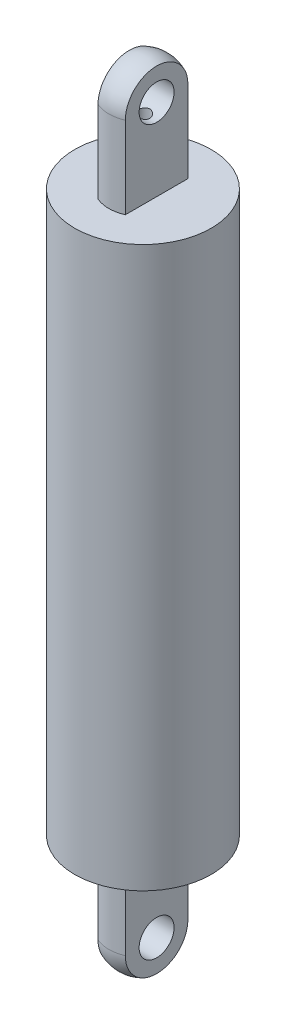
ISO-10303-21;
HEADER;
FILE_DESCRIPTION(('STEP AP214'),'2;1');
FILE_NAME('part.step','',(''),(''),'','','');
FILE_SCHEMA(('AUTOMOTIVE_DESIGN { 1 0 10303 214 1 1 1 1 }'));
ENDSEC;
DATA;
#1=APPLICATION_CONTEXT('core data for automotive mechanical design processes');
#2=APPLICATION_PROTOCOL_DEFINITION('international standard','automotive_design',2000,#1);
#3=PRODUCT_CONTEXT('',#1,'mechanical');
#4=PRODUCT('Part','Part','',(#3));
#5=PRODUCT_RELATED_PRODUCT_CATEGORY('part','',(#4));
#6=PRODUCT_DEFINITION_FORMATION('','',#4);
#7=PRODUCT_DEFINITION_CONTEXT('part definition',#1,'design');
#8=PRODUCT_DEFINITION('design','',#6,#7);
#9=PRODUCT_DEFINITION_SHAPE('','',#8);
#10=(LENGTH_UNIT() NAMED_UNIT(*) SI_UNIT(.MILLI.,.METRE.));
#11=(NAMED_UNIT(*) PLANE_ANGLE_UNIT() SI_UNIT($,.RADIAN.));
#12=(NAMED_UNIT(*) SI_UNIT($,.STERADIAN.) SOLID_ANGLE_UNIT());
#13=UNCERTAINTY_MEASURE_WITH_UNIT(LENGTH_MEASURE(1.E-05),#10,'distance_accuracy_value','');
#14=(GEOMETRIC_REPRESENTATION_CONTEXT(3) GLOBAL_UNCERTAINTY_ASSIGNED_CONTEXT((#13)) GLOBAL_UNIT_ASSIGNED_CONTEXT((#10,
#11,#12)) REPRESENTATION_CONTEXT('',''));
#15=CARTESIAN_POINT('',(0.,0.,0.));
#16=DIRECTION('',(0.,0.,1.));
#17=DIRECTION('',(1.,0.,0.));
#18=AXIS2_PLACEMENT_3D('',#15,#16,#17);
#19=CARTESIAN_POINT('',(0.,33.655,0.));
#20=DIRECTION('',(0.,1.,0.));
#21=DIRECTION('',(0.,0.,1.));
#22=AXIS2_PLACEMENT_3D('',#19,#20,#21);
#23=CYLINDRICAL_SURFACE('',#22,3.175);
#24=CARTESIAN_POINT('',(0.,-33.655,0.));
#25=DIRECTION('',(0.,1.,0.));
#26=DIRECTION('',(0.,0.,1.));
#27=AXIS2_PLACEMENT_3D('',#24,#25,#26);
#28=CIRCLE('',#27,3.175);
#29=CARTESIAN_POINT('',(1.27,-33.655,-2.90993556629696));
#30=VERTEX_POINT('',#29);
#31=CARTESIAN_POINT('',(-1.27,-33.655,-2.90993556629696));
#32=VERTEX_POINT('',#31);
#33=EDGE_CURVE('E124',#30,#32,#28,.T.);
#34=ORIENTED_EDGE('',*,*,#33,.T.);
#35=DIRECTION('',(0.,1.,0.));
#36=VECTOR('',#35,1.);
#37=CARTESIAN_POINT('',(-1.27,-36.83,-2.90993556629696));
#38=LINE('',#37,#36);
#39=CARTESIAN_POINT('',(-1.27,-26.035,-2.90993556629696));
#40=VERTEX_POINT('',#39);
#41=EDGE_CURVE('E61',#32,#40,#38,.T.);
#42=ORIENTED_EDGE('',*,*,#41,.T.);
#43=CARTESIAN_POINT('',(0.,-26.035,0.));
#44=DIRECTION('',(0.,1.,0.));
#45=DIRECTION('',(0.,0.,1.));
#46=AXIS2_PLACEMENT_3D('',#43,#44,#45);
#47=CIRCLE('',#46,3.175);
#48=CARTESIAN_POINT('',(1.27,-26.035,-2.90993556629696));
#49=VERTEX_POINT('',#48);
#50=EDGE_CURVE('E122',#49,#40,#47,.T.);
#51=ORIENTED_EDGE('',*,*,#50,.F.);
#52=DIRECTION('',(0.,1.,0.));
#53=VECTOR('',#52,1.);
#54=CARTESIAN_POINT('',(1.27,-36.83,-2.90993556629696));
#55=LINE('',#54,#53);
#56=EDGE_CURVE('E116',#30,#49,#55,.T.);
#57=ORIENTED_EDGE('',*,*,#56,.F.);
#58=EDGE_LOOP('',(#34,#42,#51,#57));
#59=FACE_BOUND('',#58,.T.);
#60=ADVANCED_FACE('F39',(#59),#23,.T.);
#61=CARTESIAN_POINT('',(-1.27,-26.035,2.90993556629695));
#62=VERTEX_POINT('',#61);
#63=CARTESIAN_POINT('',(1.27,-26.035,2.90993556629695));
#64=VERTEX_POINT('',#63);
#65=EDGE_CURVE('E131',#62,#64,#47,.T.);
#66=ORIENTED_EDGE('',*,*,#65,.F.);
#67=DIRECTION('',(0.,1.,0.));
#68=VECTOR('',#67,1.);
#69=CARTESIAN_POINT('',(-1.27,-36.83,2.90993556629695));
#70=LINE('',#69,#68);
#71=CARTESIAN_POINT('',(-1.27,-33.655,2.90993556629695));
#72=VERTEX_POINT('',#71);
#73=EDGE_CURVE('E111',#72,#62,#70,.T.);
#74=ORIENTED_EDGE('',*,*,#73,.F.);
#75=CARTESIAN_POINT('',(1.27,-33.655,2.90993556629695));
#76=VERTEX_POINT('',#75);
#77=EDGE_CURVE('E137',#72,#76,#28,.T.);
#78=ORIENTED_EDGE('',*,*,#77,.T.);
#79=DIRECTION('',(0.,1.,0.));
#80=VECTOR('',#79,1.);
#81=CARTESIAN_POINT('',(1.27,-36.83,2.90993556629695));
#82=LINE('',#81,#80);
#83=EDGE_CURVE('E68',#76,#64,#82,.T.);
#84=ORIENTED_EDGE('',*,*,#83,.T.);
#85=EDGE_LOOP('',(#66,#74,#78,#84));
#86=FACE_BOUND('',#85,.T.);
#87=ADVANCED_FACE('F195',(#86),#23,.T.);
#88=CARTESIAN_POINT('',(0.,-33.655,0.));
#89=DIRECTION('',(0.,1.,0.));
#90=DIRECTION('',(0.,0.,1.));
#91=AXIS2_PLACEMENT_3D('',#88,#89,#90);
#92=SPHERICAL_SURFACE('',#91,3.175);
#93=ORIENTED_EDGE('',*,*,#77,.F.);
#94=CARTESIAN_POINT('',(-1.27,-33.655,0.));
#95=DIRECTION('',(1.,0.,0.));
#96=DIRECTION('',(0.,0.,-1.));
#97=AXIS2_PLACEMENT_3D('',#94,#95,#96);
#98=CIRCLE('',#97,2.90993556629696);
#99=EDGE_CURVE('E11',#72,#32,#98,.T.);
#100=ORIENTED_EDGE('',*,*,#99,.T.);
#101=ORIENTED_EDGE('',*,*,#33,.F.);
#102=CARTESIAN_POINT('',(1.27,-33.655,0.));
#103=DIRECTION('',(1.,0.,0.));
#104=DIRECTION('',(0.,0.,-1.));
#105=AXIS2_PLACEMENT_3D('',#102,#103,#104);
#106=CIRCLE('',#105,2.90993556629696);
#107=EDGE_CURVE('E53',#76,#30,#106,.T.);
#108=ORIENTED_EDGE('',*,*,#107,.F.);
#109=EDGE_LOOP('',(#93,#100,#101,#108));
#110=FACE_BOUND('',#109,.T.);
#111=ADVANCED_FACE('F201',(#110),#92,.T.);
#112=CARTESIAN_POINT('',(0.,33.655,0.));
#113=DIRECTION('',(0.,1.,0.));
#114=DIRECTION('',(0.,0.,1.));
#115=AXIS2_PLACEMENT_3D('',#112,#113,#114);
#116=SPHERICAL_SURFACE('',#115,3.175);
#117=CARTESIAN_POINT('',(-1.27,33.655,0.));
#118=DIRECTION('',(-1.,0.,0.));
#119=DIRECTION('',(0.,0.,1.));
#120=AXIS2_PLACEMENT_3D('',#117,#118,#119);
#121=CIRCLE('',#120,2.90993556629696);
#122=CARTESIAN_POINT('',(-1.27,33.655,2.90993556629695));
#123=VERTEX_POINT('',#122);
#124=CARTESIAN_POINT('',(-1.27,33.655,-2.90993556629696));
#125=VERTEX_POINT('',#124);
#126=EDGE_CURVE('E246',#123,#125,#121,.T.);
#127=ORIENTED_EDGE('',*,*,#126,.F.);
#128=CARTESIAN_POINT('',(0.,33.655,0.));
#129=DIRECTION('',(0.,1.,0.));
#130=DIRECTION('',(0.,0.,1.));
#131=AXIS2_PLACEMENT_3D('',#128,#129,#130);
#132=CIRCLE('',#131,3.175);
#133=CARTESIAN_POINT('',(1.27,33.655,2.90993556629695));
#134=VERTEX_POINT('',#133);
#135=EDGE_CURVE('E146',#123,#134,#132,.T.);
#136=ORIENTED_EDGE('',*,*,#135,.T.);
#137=CARTESIAN_POINT('',(1.27,33.655,0.));
#138=DIRECTION('',(-1.,0.,0.));
#139=DIRECTION('',(0.,0.,1.));
#140=AXIS2_PLACEMENT_3D('',#137,#138,#139);
#141=CIRCLE('',#140,2.90993556629696);
#142=CARTESIAN_POINT('',(1.27,33.655,-2.90993556629696));
#143=VERTEX_POINT('',#142);
#144=EDGE_CURVE('E227',#134,#143,#141,.T.);
#145=ORIENTED_EDGE('',*,*,#144,.T.);
#146=EDGE_CURVE('E149',#143,#125,#132,.T.);
#147=ORIENTED_EDGE('',*,*,#146,.T.);
#148=EDGE_LOOP('',(#127,#136,#145,#147));
#149=FACE_BOUND('',#148,.T.);
#150=ADVANCED_FACE('F41',(#149),#116,.T.);
#151=CARTESIAN_POINT('',(0.,33.655,0.));
#152=DIRECTION('',(0.,1.,0.));
#153=DIRECTION('',(0.,0.,1.));
#154=AXIS2_PLACEMENT_3D('',#151,#152,#153);
#155=CYLINDRICAL_SURFACE('',#154,3.175);
#156=DIRECTION('',(0.,-1.,0.));
#157=VECTOR('',#156,1.);
#158=CARTESIAN_POINT('',(-1.27,36.83,2.90993556629695));
#159=LINE('',#158,#157);
#160=CARTESIAN_POINT('',(-1.27,26.035,2.90993556629695));
#161=VERTEX_POINT('',#160);
#162=EDGE_CURVE('E222',#123,#161,#159,.T.);
#163=ORIENTED_EDGE('',*,*,#162,.T.);
#164=CARTESIAN_POINT('',(0.,26.035,0.));
#165=DIRECTION('',(0.,1.,0.));
#166=DIRECTION('',(0.,0.,1.));
#167=AXIS2_PLACEMENT_3D('',#164,#165,#166);
#168=CIRCLE('',#167,3.175);
#169=CARTESIAN_POINT('',(1.27,26.035,2.90993556629695));
#170=VERTEX_POINT('',#169);
#171=EDGE_CURVE('E142',#161,#170,#168,.T.);
#172=ORIENTED_EDGE('',*,*,#171,.T.);
#173=DIRECTION('',(0.,-1.,0.));
#174=VECTOR('',#173,1.);
#175=CARTESIAN_POINT('',(1.27,36.83,2.90993556629695));
#176=LINE('',#175,#174);
#177=EDGE_CURVE('E239',#134,#170,#176,.T.);
#178=ORIENTED_EDGE('',*,*,#177,.F.);
#179=ORIENTED_EDGE('',*,*,#135,.F.);
#180=EDGE_LOOP('',(#163,#172,#178,#179));
#181=FACE_BOUND('',#180,.T.);
#182=ADVANCED_FACE('F211',(#181),#155,.T.);
#183=DIRECTION('',(0.,-1.,0.));
#184=VECTOR('',#183,1.);
#185=CARTESIAN_POINT('',(-1.27,36.83,-2.90993556629696));
#186=LINE('',#185,#184);
#187=CARTESIAN_POINT('',(-1.27,26.035,-2.90993556629696));
#188=VERTEX_POINT('',#187);
#189=EDGE_CURVE('E228',#125,#188,#186,.T.);
#190=ORIENTED_EDGE('',*,*,#189,.F.);
#191=ORIENTED_EDGE('',*,*,#146,.F.);
#192=DIRECTION('',(0.,-1.,0.));
#193=VECTOR('',#192,1.);
#194=CARTESIAN_POINT('',(1.27,36.83,-2.90993556629696));
#195=LINE('',#194,#193);
#196=CARTESIAN_POINT('',(1.27,26.035,-2.90993556629696));
#197=VERTEX_POINT('',#196);
#198=EDGE_CURVE('E237',#143,#197,#195,.T.);
#199=ORIENTED_EDGE('',*,*,#198,.T.);
#200=EDGE_CURVE('E145',#197,#188,#168,.T.);
#201=ORIENTED_EDGE('',*,*,#200,.T.);
#202=EDGE_LOOP('',(#190,#191,#199,#201));
#203=FACE_BOUND('',#202,.T.);
#204=ADVANCED_FACE('F209',(#203),#155,.T.);
#205=CARTESIAN_POINT('',(0.,26.035,3.17499999999999));
#206=DIRECTION('',(0.,-1.,0.));
#207=DIRECTION('',(0.,0.,-1.));
#208=AXIS2_PLACEMENT_3D('',#205,#206,#207);
#209=PLANE('',#208);
#210=ORIENTED_EDGE('',*,*,#200,.F.);
#211=DIRECTION('',(0.,0.,-1.));
#212=VECTOR('',#211,1.);
#213=CARTESIAN_POINT('',(1.27,26.035,0.));
#214=LINE('',#213,#212);
#215=EDGE_CURVE('E125',#170,#197,#214,.T.);
#216=ORIENTED_EDGE('',*,*,#215,.F.);
#217=ORIENTED_EDGE('',*,*,#171,.F.);
#218=DIRECTION('',(0.,0.,-1.));
#219=VECTOR('',#218,1.);
#220=CARTESIAN_POINT('',(-1.27,26.035,0.));
#221=LINE('',#220,#219);
#222=EDGE_CURVE('E232',#161,#188,#221,.T.);
#223=ORIENTED_EDGE('',*,*,#222,.T.);
#224=EDGE_LOOP('',(#210,#216,#217,#223));
#225=FACE_BOUND('',#224,.T.);
#226=CARTESIAN_POINT('',(0.,26.035,0.));
#227=DIRECTION('',(0.,1.,0.));
#228=DIRECTION('',(0.,0.,1.));
#229=AXIS2_PLACEMENT_3D('',#226,#227,#228);
#230=CIRCLE('',#229,6.35);
#231=CARTESIAN_POINT('',(0.,26.035,6.34999999999999));
#232=VERTEX_POINT('',#231);
#233=EDGE_CURVE('E134',#232,#232,#230,.T.);
#234=ORIENTED_EDGE('',*,*,#233,.T.);
#235=EDGE_LOOP('',(#234));
#236=FACE_BOUND('',#235,.T.);
#237=ADVANCED_FACE('F207',(#225,#236),#209,.F.);
#238=CARTESIAN_POINT('',(0.,33.655,0.));
#239=DIRECTION('',(0.,1.,0.));
#240=DIRECTION('',(0.,0.,1.));
#241=AXIS2_PLACEMENT_3D('',#238,#239,#240);
#242=CYLINDRICAL_SURFACE('',#241,6.35);
#243=ORIENTED_EDGE('',*,*,#233,.F.);
#244=EDGE_LOOP('',(#243));
#245=FACE_BOUND('',#244,.T.);
#246=CARTESIAN_POINT('',(0.,-26.035,0.));
#247=DIRECTION('',(0.,1.,0.));
#248=DIRECTION('',(0.,0.,1.));
#249=AXIS2_PLACEMENT_3D('',#246,#247,#248);
#250=CIRCLE('',#249,6.35);
#251=CARTESIAN_POINT('',(0.,-26.035,6.34999999999999));
#252=VERTEX_POINT('',#251);
#253=EDGE_CURVE('E130',#252,#252,#250,.T.);
#254=ORIENTED_EDGE('',*,*,#253,.T.);
#255=EDGE_LOOP('',(#254));
#256=FACE_BOUND('',#255,.T.);
#257=ADVANCED_FACE('F189',(#245,#256),#242,.T.);
#258=CARTESIAN_POINT('',(0.,-26.035,3.17499999999999));
#259=DIRECTION('',(0.,1.,0.));
#260=DIRECTION('',(0.,0.,1.));
#261=AXIS2_PLACEMENT_3D('',#258,#259,#260);
#262=PLANE('',#261);
#263=ORIENTED_EDGE('',*,*,#253,.F.);
#264=EDGE_LOOP('',(#263));
#265=FACE_BOUND('',#264,.T.);
#266=ORIENTED_EDGE('',*,*,#65,.T.);
#267=DIRECTION('',(0.,0.,-1.));
#268=VECTOR('',#267,1.);
#269=CARTESIAN_POINT('',(1.27,-26.035,0.));
#270=LINE('',#269,#268);
#271=EDGE_CURVE('E129',#64,#49,#270,.T.);
#272=ORIENTED_EDGE('',*,*,#271,.T.);
#273=ORIENTED_EDGE('',*,*,#50,.T.);
#274=DIRECTION('',(0.,0.,-1.));
#275=VECTOR('',#274,1.);
#276=CARTESIAN_POINT('',(-1.27,-26.035,0.));
#277=LINE('',#276,#275);
#278=EDGE_CURVE('E108',#62,#40,#277,.T.);
#279=ORIENTED_EDGE('',*,*,#278,.F.);
#280=EDGE_LOOP('',(#266,#272,#273,#279));
#281=FACE_BOUND('',#280,.T.);
#282=ADVANCED_FACE('F128',(#265,#281),#262,.F.);
#283=CARTESIAN_POINT('',(1.27,36.83,0.));
#284=DIRECTION('',(-1.,0.,0.));
#285=DIRECTION('',(0.,0.,1.));
#286=AXIS2_PLACEMENT_3D('',#283,#284,#285);
#287=PLANE('',#286);
#288=CARTESIAN_POINT('',(1.27,33.655,0.));
#289=DIRECTION('',(1.,0.,0.));
#290=DIRECTION('',(0.,0.,-1.));
#291=AXIS2_PLACEMENT_3D('',#288,#289,#290);
#292=CIRCLE('',#291,1.627);
#293=CARTESIAN_POINT('',(1.27,33.655,-1.62700000000001));
#294=VERTEX_POINT('',#293);
#295=EDGE_CURVE('E158',#294,#294,#292,.T.);
#296=ORIENTED_EDGE('',*,*,#295,.F.);
#297=EDGE_LOOP('',(#296));
#298=FACE_BOUND('',#297,.T.);
#299=ORIENTED_EDGE('',*,*,#177,.T.);
#300=ORIENTED_EDGE('',*,*,#215,.T.);
#301=ORIENTED_EDGE('',*,*,#198,.F.);
#302=ORIENTED_EDGE('',*,*,#144,.F.);
#303=EDGE_LOOP('',(#299,#300,#301,#302));
#304=FACE_BOUND('',#303,.T.);
#305=ADVANCED_FACE('F182',(#298,#304),#287,.F.);
#306=CARTESIAN_POINT('',(-1.27,36.83,0.));
#307=DIRECTION('',(-1.,0.,0.));
#308=DIRECTION('',(0.,0.,1.));
#309=AXIS2_PLACEMENT_3D('',#306,#307,#308);
#310=PLANE('',#309);
#311=CARTESIAN_POINT('',(-1.27,33.655,0.));
#312=DIRECTION('',(-1.,0.,0.));
#313=DIRECTION('',(0.,0.,1.));
#314=AXIS2_PLACEMENT_3D('',#311,#312,#313);
#315=CIRCLE('',#314,1.627);
#316=CARTESIAN_POINT('',(-1.27,33.655,1.62699999999999));
#317=VERTEX_POINT('',#316);
#318=EDGE_CURVE('E157',#317,#317,#315,.T.);
#319=ORIENTED_EDGE('',*,*,#318,.F.);
#320=EDGE_LOOP('',(#319));
#321=FACE_BOUND('',#320,.T.);
#322=ORIENTED_EDGE('',*,*,#126,.T.);
#323=ORIENTED_EDGE('',*,*,#189,.T.);
#324=ORIENTED_EDGE('',*,*,#222,.F.);
#325=ORIENTED_EDGE('',*,*,#162,.F.);
#326=EDGE_LOOP('',(#322,#323,#324,#325));
#327=FACE_BOUND('',#326,.T.);
#328=ADVANCED_FACE('F179',(#321,#327),#310,.T.);
#329=CARTESIAN_POINT('',(1.27,-36.83,0.));
#330=DIRECTION('',(1.,0.,0.));
#331=DIRECTION('',(0.,0.,-1.));
#332=AXIS2_PLACEMENT_3D('',#329,#330,#331);
#333=PLANE('',#332);
#334=CARTESIAN_POINT('',(1.27,-33.655,0.));
#335=DIRECTION('',(1.,0.,0.));
#336=DIRECTION('',(0.,0.,-1.));
#337=AXIS2_PLACEMENT_3D('',#334,#335,#336);
#338=CIRCLE('',#337,1.627);
#339=CARTESIAN_POINT('',(1.27,-33.655,-1.62700000000001));
#340=VERTEX_POINT('',#339);
#341=EDGE_CURVE('E277',#340,#340,#338,.T.);
#342=ORIENTED_EDGE('',*,*,#341,.F.);
#343=EDGE_LOOP('',(#342));
#344=FACE_BOUND('',#343,.T.);
#345=ORIENTED_EDGE('',*,*,#107,.T.);
#346=ORIENTED_EDGE('',*,*,#56,.T.);
#347=ORIENTED_EDGE('',*,*,#271,.F.);
#348=ORIENTED_EDGE('',*,*,#83,.F.);
#349=EDGE_LOOP('',(#345,#346,#347,#348));
#350=FACE_BOUND('',#349,.T.);
#351=ADVANCED_FACE('F175',(#344,#350),#333,.T.);
#352=CARTESIAN_POINT('',(-1.27,-36.83,0.));
#353=DIRECTION('',(1.,0.,0.));
#354=DIRECTION('',(0.,0.,-1.));
#355=AXIS2_PLACEMENT_3D('',#352,#353,#354);
#356=PLANE('',#355);
#357=CARTESIAN_POINT('',(-1.27,-33.655,0.));
#358=DIRECTION('',(1.,0.,0.));
#359=DIRECTION('',(0.,0.,-1.));
#360=AXIS2_PLACEMENT_3D('',#357,#358,#359);
#361=CIRCLE('',#360,1.627);
#362=CARTESIAN_POINT('',(-1.27,-33.655,-1.62700000000001));
#363=VERTEX_POINT('',#362);
#364=EDGE_CURVE('E270',#363,#363,#361,.T.);
#365=ORIENTED_EDGE('',*,*,#364,.T.);
#366=EDGE_LOOP('',(#365));
#367=FACE_BOUND('',#366,.T.);
#368=ORIENTED_EDGE('',*,*,#73,.T.);
#369=ORIENTED_EDGE('',*,*,#278,.T.);
#370=ORIENTED_EDGE('',*,*,#41,.F.);
#371=ORIENTED_EDGE('',*,*,#99,.F.);
#372=EDGE_LOOP('',(#368,#369,#370,#371));
#373=FACE_BOUND('',#372,.T.);
#374=ADVANCED_FACE('F109',(#367,#373),#356,.F.);
#375=CARTESIAN_POINT('',(-6.35,33.655,0.));
#376=DIRECTION('',(1.,0.,0.));
#377=DIRECTION('',(0.,0.,-1.));
#378=AXIS2_PLACEMENT_3D('',#375,#376,#377);
#379=CYLINDRICAL_SURFACE('',#378,1.627);
#380=ORIENTED_EDGE('',*,*,#318,.T.);
#381=EDGE_LOOP('',(#380));
#382=FACE_BOUND('',#381,.T.);
#383=CARTESIAN_POINT('',(0.,32.157033378209,0.634999999999991));
#384=CARTESIAN_POINT('',(-0.034175607189574,32.1570351723678,0.63500183932402));
#385=CARTESIAN_POINT('',(-0.0683397244226082,32.1558511835887,0.632231929951331));
#386=CARTESIAN_POINT('',(-0.135631172071987,32.1512801662181,0.621281481817421));
#387=CARTESIAN_POINT('',(-0.168758595955889,32.1478933368364,0.613101432311161));
#388=CARTESIAN_POINT('',(-0.232983302009291,32.1393574907449,0.591682137368026));
#389=CARTESIAN_POINT('',(-0.264085576939568,32.1342130195811,0.578455931911288));
#390=CARTESIAN_POINT('',(-0.323642193094697,32.1227491603127,0.547366464748788));
#391=CARTESIAN_POINT('',(-0.352095669626303,32.1164293905392,0.529501695957632));
#392=CARTESIAN_POINT('',(-0.407081822193419,32.102945310168,0.488610391464089));
#393=CARTESIAN_POINT('',(-0.43345174418174,32.0957547756635,0.465373592314362));
#394=CARTESIAN_POINT('',(-0.482036572156737,32.0815571043641,0.41484293945535));
#395=CARTESIAN_POINT('',(-0.504250493980546,32.074550011346,0.387548127526469));
#396=CARTESIAN_POINT('',(-0.544695276116175,32.0611937473742,0.328422845778443));
#397=CARTESIAN_POINT('',(-0.562746687870122,32.054878860444,0.296461182283711));
#398=CARTESIAN_POINT('',(-0.593147774886062,32.0439363099161,0.22966427043901));
#399=CARTESIAN_POINT('',(-0.605499605809712,32.0393080085676,0.194830114391376));
#400=CARTESIAN_POINT('',(-0.623572449602518,32.0324464838259,0.124989854467328));
#401=CARTESIAN_POINT('',(-0.629574223015851,32.0301122067617,0.0900665292405033));
#402=CARTESIAN_POINT('',(-0.635678895009102,32.0277375117914,0.0196355584853128));
#403=CARTESIAN_POINT('',(-0.635783871906567,32.0276962857027,-0.015871876760671));
#404=CARTESIAN_POINT('',(-0.630249654866893,32.0298497521898,-0.0844405458569177));
#405=CARTESIAN_POINT('',(-0.624917591706195,32.0319248951441,-0.117530992434519));
#406=CARTESIAN_POINT('',(-0.609180784148746,32.0379185034826,-0.182304293617838));
#407=CARTESIAN_POINT('',(-0.59877567786212,32.0418371003705,-0.213987047628644));
#408=CARTESIAN_POINT('',(-0.573058961421459,32.0512058894899,-0.275608535770085));
#409=CARTESIAN_POINT('',(-0.557676542067525,32.0566780363195,-0.305514242905016));
#410=CARTESIAN_POINT('',(-0.522506661643956,32.0686066304195,-0.362396115602885));
#411=CARTESIAN_POINT('',(-0.502717720499885,32.0750634081802,-0.389371292311176));
#412=CARTESIAN_POINT('',(-0.457845000639074,32.0887809836563,-0.441425688282831));
#413=CARTESIAN_POINT('',(-0.432506579734241,32.0960668088799,-0.466279134134579));
#414=CARTESIAN_POINT('',(-0.377986801146246,32.1103037800619,-0.511473636142813));
#415=CARTESIAN_POINT('',(-0.348804310400437,32.1172548265143,-0.531813357087641));
#416=CARTESIAN_POINT('',(-0.286462536976218,32.1302005666321,-0.567885161975138));
#417=CARTESIAN_POINT('',(-0.253220142311159,32.136165993659,-0.583484976902602));
#418=CARTESIAN_POINT('',(-0.184285518451289,32.1461241122128,-0.608777074454642));
#419=CARTESIAN_POINT('',(-0.148594804640426,32.1501180116876,-0.618472975239099));
#420=CARTESIAN_POINT('',(-0.0780213020197254,32.1553909691447,-0.631146904282569));
#421=CARTESIAN_POINT('',(-0.0432144698179266,32.1568158935882,-0.634486525907412));
#422=CARTESIAN_POINT('',(0.0264838096446982,32.1572041474884,-0.635403266735756));
#423=CARTESIAN_POINT('',(0.0613752303569779,32.1561681690918,-0.63298200622885));
#424=CARTESIAN_POINT('',(0.128306182569504,32.1519004463234,-0.622774436227281));
#425=CARTESIAN_POINT('',(0.160398755152632,32.1487882560691,-0.615279930229161));
#426=CARTESIAN_POINT('',(0.222852297905737,32.1408645171455,-0.595512632752877));
#427=CARTESIAN_POINT('',(0.253212893985931,32.1360526029547,-0.583238813436792));
#428=CARTESIAN_POINT('',(0.312673426493113,32.1250390762288,-0.553719558835788));
#429=CARTESIAN_POINT('',(0.341676532828171,32.1187901712353,-0.536297262904196));
#430=CARTESIAN_POINT('',(0.396474940198074,32.1056817384649,-0.497159269090283));
#431=CARTESIAN_POINT('',(0.422268979072801,32.0988219722385,-0.47544189054872));
#432=CARTESIAN_POINT('',(0.47178375664611,32.0846873996561,-0.426542102858492));
#433=CARTESIAN_POINT('',(0.49523480062942,32.0774169785221,-0.39908433942074));
#434=CARTESIAN_POINT('',(0.537234451638914,32.0637332685191,-0.340447433471409));
#435=CARTESIAN_POINT('',(0.555782936583528,32.0573200009965,-0.309268198317283));
#436=CARTESIAN_POINT('',(0.587359146215386,32.0460634296283,-0.244018512449137));
#437=CARTESIAN_POINT('',(0.600395782526051,32.0412175945431,-0.209952836466266));
#438=CARTESIAN_POINT('',(0.620472225148341,32.0336418067138,-0.139877564569418));
#439=CARTESIAN_POINT('',(0.627515115319234,32.0309107659461,-0.103868978461809));
#440=CARTESIAN_POINT('',(0.635051318609989,32.0279832863495,-0.0333576913000701));
#441=CARTESIAN_POINT('',(0.635926643578831,32.0276390354911,0.00109837676146093));
#442=CARTESIAN_POINT('',(0.632101341326076,32.0291301134087,0.0696478571467251));
#443=CARTESIAN_POINT('',(0.62740148442438,32.030965141075,0.103741318914931));
#444=CARTESIAN_POINT('',(0.612830732683991,32.0365370761326,0.169617289453099));
#445=CARTESIAN_POINT('',(0.603109128658899,32.0402189908198,0.20143783525507));
#446=CARTESIAN_POINT('',(0.578924375802907,32.0490948701894,0.262993854629609));
#447=CARTESIAN_POINT('',(0.564460330461814,32.0542891207427,0.292728932674596));
#448=CARTESIAN_POINT('',(0.530490090969576,32.0659566568846,0.350688216648708));
#449=CARTESIAN_POINT('',(0.510792088529331,32.0724757176602,0.378790601871024));
#450=CARTESIAN_POINT('',(0.467207020485922,32.0860011176527,0.431405512309831));
#451=CARTESIAN_POINT('',(0.443318416682775,32.0930076352233,0.455916713264168));
#452=CARTESIAN_POINT('',(0.3903801943988,32.1072226889108,0.502128433968704));
#453=CARTESIAN_POINT('',(0.361111053494799,32.1144192322637,0.52358218535802));
#454=CARTESIAN_POINT('',(0.299159063720183,32.12775211705,0.561288024615731));
#455=CARTESIAN_POINT('',(0.266475291791793,32.1338881706111,0.577538701115848));
#456=CARTESIAN_POINT('',(0.195808637676378,32.1447233722449,0.60533988928544));
#457=CARTESIAN_POINT('',(0.157611018017682,32.1492687794565,0.616411839316287));
#458=CARTESIAN_POINT('',(0.0796028290551253,32.1554215195513,0.631237789189522));
#459=CARTESIAN_POINT('',(0.0397936255055941,32.1570312891141,0.634997858315392));
#460=CARTESIAN_POINT('',(0.,32.157033378209,0.634999999999991));
#461=B_SPLINE_CURVE_WITH_KNOTS('',3,(#383,#384,#385,#386,#387,#388,#389,#390,#391,#392,#393,
#394,#395,#396,#397,#398,#399,#400,#401,#402,#403,#404,#405,#406,#407,#408,#409,#410,#411,#412,
#413,#414,#415,#416,#417,#418,#419,#420,#421,#422,#423,#424,#425,#426,#427,#428,#429,#430,#431,
#432,#433,#434,#435,#436,#437,#438,#439,#440,#441,#442,#443,#444,#445,#446,#447,#448,#449,#450,
#451,#452,#453,#454,#455,#456,#457,#458,#459,#460),.UNSPECIFIED.,.T.,.F.,(4,2,2,2,2,2,2,2,2,2,2,
2,2,2,2,2,2,2,2,2,2,2,2,2,2,2,2,2,2,2,2,2,2,2,2,2,2,2,4),(0.,0.102378335596324,
0.204747414082879,0.306853728767649,0.408993259752756,0.516144522657905,0.623321127522019,
0.734494932449747,0.845626655346578,0.951608276878337,1.05755254510385,1.15782661237157,
1.25810783382254,1.35988351447898,1.46169343152841,1.5699032039886,1.6781449435995,
1.78917650812807,1.90013995931145,2.00457666150625,2.10898399359874,2.20784558072602,
2.30672844075434,2.40950808465338,2.51232802592635,2.62231226660414,2.73229924580765,
2.84210771033042,2.95185964277363,3.05474869970196,3.15762354215995,3.25760242329466,
3.35760021532523,3.46194379990245,3.56632576523029,3.67678573502841,3.78727564248451,
3.90658269798688,4.0257906793991),.UNSPECIFIED.);
#462=CARTESIAN_POINT('',(0.,32.157033378209,0.634999999999991));
#463=VERTEX_POINT('',#462);
#464=EDGE_CURVE('E150',#463,#463,#461,.T.);
#465=ORIENTED_EDGE('',*,*,#464,.T.);
#466=EDGE_LOOP('',(#465));
#467=FACE_BOUND('',#466,.T.);
#468=ORIENTED_EDGE('',*,*,#295,.T.);
#469=EDGE_LOOP('',(#468));
#470=FACE_BOUND('',#469,.T.);
#471=ADVANCED_FACE('F163',(#382,#467,#470),#379,.F.);
#472=CARTESIAN_POINT('',(-6.35,-33.655,0.));
#473=DIRECTION('',(1.,0.,0.));
#474=DIRECTION('',(0.,0.,-1.));
#475=AXIS2_PLACEMENT_3D('',#472,#473,#474);
#476=CYLINDRICAL_SURFACE('',#475,1.627);
#477=ORIENTED_EDGE('',*,*,#341,.T.);
#478=EDGE_LOOP('',(#477));
#479=FACE_BOUND('',#478,.T.);
#480=CARTESIAN_POINT('',(0.,-32.157033378209,0.634999999999992));
#481=CARTESIAN_POINT('',(0.0341756071895736,-32.1570351723678,0.635001839324021));
#482=CARTESIAN_POINT('',(0.0683397244226075,-32.1558511835887,0.632231929951332));
#483=CARTESIAN_POINT('',(0.135631172071986,-32.1512801662181,0.621281481817422));
#484=CARTESIAN_POINT('',(0.168758595955888,-32.1478933368364,0.613101432311162));
#485=CARTESIAN_POINT('',(0.23298330200929,-32.1393574907449,0.591682137368027));
#486=CARTESIAN_POINT('',(0.264085576939567,-32.1342130195811,0.578455931911289));
#487=CARTESIAN_POINT('',(0.323642193094697,-32.1227491603127,0.54736646474879));
#488=CARTESIAN_POINT('',(0.352095669626302,-32.1164293905392,0.529501695957633));
#489=CARTESIAN_POINT('',(0.407081822193418,-32.102945310168,0.48861039146409));
#490=CARTESIAN_POINT('',(0.433451744181739,-32.0957547756635,0.465373592314364));
#491=CARTESIAN_POINT('',(0.482036572156736,-32.0815571043641,0.414842939455352));
#492=CARTESIAN_POINT('',(0.504250493980546,-32.074550011346,0.387548127526471));
#493=CARTESIAN_POINT('',(0.544695276116174,-32.0611937473742,0.328422845778444));
#494=CARTESIAN_POINT('',(0.562746687870122,-32.054878860444,0.296461182283713));
#495=CARTESIAN_POINT('',(0.593147774886063,-32.0439363099161,0.229664270439011));
#496=CARTESIAN_POINT('',(0.605499605809712,-32.0393080085676,0.194830114391378));
#497=CARTESIAN_POINT('',(0.623572449602518,-32.0324464838259,0.12498985446733));
#498=CARTESIAN_POINT('',(0.629574223015851,-32.0301122067617,0.0900665292405051));
#499=CARTESIAN_POINT('',(0.635678895009103,-32.0277375117914,0.0196355584853147));
#500=CARTESIAN_POINT('',(0.635783871906568,-32.0276962857027,-0.0158718767606689));
#501=CARTESIAN_POINT('',(0.630249654866893,-32.0298497521898,-0.0844405458569154));
#502=CARTESIAN_POINT('',(0.624917591706196,-32.0319248951441,-0.117530992434517));
#503=CARTESIAN_POINT('',(0.609180784148747,-32.0379185034826,-0.182304293617836));
#504=CARTESIAN_POINT('',(0.598775677862122,-32.0418371003705,-0.213987047628641));
#505=CARTESIAN_POINT('',(0.573058961421461,-32.0512058894899,-0.275608535770083));
#506=CARTESIAN_POINT('',(0.557676542067527,-32.0566780363195,-0.305514242905014));
#507=CARTESIAN_POINT('',(0.522506661643958,-32.0686066304195,-0.362396115602884));
#508=CARTESIAN_POINT('',(0.502717720499887,-32.0750634081802,-0.389371292311175));
#509=CARTESIAN_POINT('',(0.457845000639076,-32.0887809836563,-0.44142568828283));
#510=CARTESIAN_POINT('',(0.432506579734243,-32.0960668088799,-0.466279134134579));
#511=CARTESIAN_POINT('',(0.377986801146248,-32.110303780062,-0.511473636142812));
#512=CARTESIAN_POINT('',(0.348804310400439,-32.1172548265143,-0.531813357087641));
#513=CARTESIAN_POINT('',(0.286462536976219,-32.1302005666321,-0.567885161975138));
#514=CARTESIAN_POINT('',(0.25322014231116,-32.136165993659,-0.583484976902602));
#515=CARTESIAN_POINT('',(0.18428551845129,-32.1461241122128,-0.608777074454642));
#516=CARTESIAN_POINT('',(0.148594804640427,-32.1501180116876,-0.6184729752391));
#517=CARTESIAN_POINT('',(0.0780213020197271,-32.1553909691447,-0.63114690428257));
#518=CARTESIAN_POINT('',(0.0432144698179283,-32.1568158935882,-0.634486525907412));
#519=CARTESIAN_POINT('',(-0.0264838096446961,-32.1572041474884,-0.635403266735756));
#520=CARTESIAN_POINT('',(-0.0613752303569755,-32.1561681690918,-0.632982006228851));
#521=CARTESIAN_POINT('',(-0.128306182569502,-32.1519004463234,-0.622774436227282));
#522=CARTESIAN_POINT('',(-0.16039875515263,-32.1487882560691,-0.615279930229162));
#523=CARTESIAN_POINT('',(-0.222852297905736,-32.1408645171455,-0.595512632752879));
#524=CARTESIAN_POINT('',(-0.25321289398593,-32.1360526029547,-0.583238813436794));
#525=CARTESIAN_POINT('',(-0.312673426493112,-32.1250390762288,-0.553719558835789));
#526=CARTESIAN_POINT('',(-0.341676532828171,-32.1187901712353,-0.536297262904197));
#527=CARTESIAN_POINT('',(-0.396474940198074,-32.1056817384649,-0.497159269090283));
#528=CARTESIAN_POINT('',(-0.422268979072801,-32.0988219722385,-0.47544189054872));
#529=CARTESIAN_POINT('',(-0.47178375664611,-32.0846873996561,-0.426542102858492));
#530=CARTESIAN_POINT('',(-0.49523480062942,-32.0774169785221,-0.399084339420741));
#531=CARTESIAN_POINT('',(-0.537234451638915,-32.0637332685191,-0.34044743347141));
#532=CARTESIAN_POINT('',(-0.555782936583528,-32.0573200009965,-0.309268198317284));
#533=CARTESIAN_POINT('',(-0.587359146215386,-32.0460634296283,-0.244018512449138));
#534=CARTESIAN_POINT('',(-0.600395782526051,-32.0412175945431,-0.209952836466267));
#535=CARTESIAN_POINT('',(-0.620472225148341,-32.0336418067138,-0.139877564569418));
#536=CARTESIAN_POINT('',(-0.627515115319235,-32.0309107659461,-0.10386897846181));
#537=CARTESIAN_POINT('',(-0.63505131860999,-32.0279832863495,-0.0333576913000706));
#538=CARTESIAN_POINT('',(-0.635926643578831,-32.0276390354911,0.0010983767614604));
#539=CARTESIAN_POINT('',(-0.632101341326077,-32.0291301134087,0.0696478571467244));
#540=CARTESIAN_POINT('',(-0.627401484424381,-32.030965141075,0.10374131891493));
#541=CARTESIAN_POINT('',(-0.612830732683992,-32.0365370761326,0.169617289453098));
#542=CARTESIAN_POINT('',(-0.603109128658899,-32.0402189908198,0.201437835255069));
#543=CARTESIAN_POINT('',(-0.578924375802908,-32.0490948701894,0.262993854629609));
#544=CARTESIAN_POINT('',(-0.564460330461816,-32.0542891207427,0.292728932674595));
#545=CARTESIAN_POINT('',(-0.530490090969577,-32.0659566568846,0.350688216648708));
#546=CARTESIAN_POINT('',(-0.510792088529332,-32.0724757176603,0.378790601871024));
#547=CARTESIAN_POINT('',(-0.467207020485923,-32.0860011176527,0.431405512309831));
#548=CARTESIAN_POINT('',(-0.443318416682777,-32.0930076352233,0.455916713264168));
#549=CARTESIAN_POINT('',(-0.390380194398802,-32.1072226889108,0.502128433968704));
#550=CARTESIAN_POINT('',(-0.3611110534948,-32.1144192322637,0.52358218535802));
#551=CARTESIAN_POINT('',(-0.299159063720184,-32.12775211705,0.561288024615732));
#552=CARTESIAN_POINT('',(-0.266475291791795,-32.1338881706111,0.577538701115848));
#553=CARTESIAN_POINT('',(-0.19580863767638,-32.1447233722449,0.60533988928544));
#554=CARTESIAN_POINT('',(-0.157611018017683,-32.1492687794565,0.616411839316287));
#555=CARTESIAN_POINT('',(-0.0796028290551252,-32.1554215195513,0.631237789189523));
#556=CARTESIAN_POINT('',(-0.0397936255055941,-32.1570312891141,0.634997858315392));
#557=CARTESIAN_POINT('',(0.,-32.157033378209,0.634999999999992));
#558=B_SPLINE_CURVE_WITH_KNOTS('',3,(#480,#481,#482,#483,#484,#485,#486,#487,#488,#489,#490,
#491,#492,#493,#494,#495,#496,#497,#498,#499,#500,#501,#502,#503,#504,#505,#506,#507,#508,#509,
#510,#511,#512,#513,#514,#515,#516,#517,#518,#519,#520,#521,#522,#523,#524,#525,#526,#527,#528,
#529,#530,#531,#532,#533,#534,#535,#536,#537,#538,#539,#540,#541,#542,#543,#544,#545,#546,#547,
#548,#549,#550,#551,#552,#553,#554,#555,#556,#557),.UNSPECIFIED.,.T.,.F.,(4,2,2,2,2,2,2,2,2,2,2,
2,2,2,2,2,2,2,2,2,2,2,2,2,2,2,2,2,2,2,2,2,2,2,2,2,2,2,4),(0.,0.102378335596324,
0.204747414082878,0.306853728767649,0.408993259752754,0.516144522657902,0.623321127522019,
0.734494932449746,0.845626655346577,0.951608276878336,1.05755254510385,1.15782661237157,
1.25810783382254,1.35988351447897,1.46169343152841,1.5699032039886,1.6781449435995,
1.78917650812808,1.90013995931145,2.00457666150624,2.10898399359874,2.20784558072602,
2.30672844075434,2.40950808465338,2.51232802592635,2.62231226660414,2.73229924580766,
2.84210771033042,2.95185964277363,3.05474869970196,3.15762354215995,3.25760242329466,
3.35760021532524,3.46194379990245,3.56632576523029,3.67678573502841,3.78727564248451,
3.90658269798689,4.02579067939911),.UNSPECIFIED.);
#559=CARTESIAN_POINT('',(0.,-32.157033378209,0.634999999999992));
#560=VERTEX_POINT('',#559);
#561=EDGE_CURVE('E43',#560,#560,#558,.T.);
#562=ORIENTED_EDGE('',*,*,#561,.T.);
#563=EDGE_LOOP('',(#562));
#564=FACE_BOUND('',#563,.T.);
#565=ORIENTED_EDGE('',*,*,#364,.F.);
#566=EDGE_LOOP('',(#565));
#567=FACE_BOUND('',#566,.T.);
#568=ADVANCED_FACE('F166',(#479,#564,#567),#476,.F.);
#569=CARTESIAN_POINT('',(0.,33.655,0.));
#570=DIRECTION('',(0.,1.,0.));
#571=DIRECTION('',(0.,0.,1.));
#572=AXIS2_PLACEMENT_3D('',#569,#570,#571);
#573=CYLINDRICAL_SURFACE('',#572,0.634999999999999);
#574=ORIENTED_EDGE('',*,*,#561,.F.);
#575=EDGE_LOOP('',(#574));
#576=FACE_BOUND('',#575,.T.);
#577=CARTESIAN_POINT('',(0.,-23.495,0.));
#578=DIRECTION('',(0.,1.,0.));
#579=DIRECTION('',(0.,0.,1.));
#580=AXIS2_PLACEMENT_3D('',#577,#578,#579);
#581=CIRCLE('',#580,0.634999999999998);
#582=CARTESIAN_POINT('',(0.,-23.495,0.634999999999991));
#583=VERTEX_POINT('',#582);
#584=EDGE_CURVE('E256',#583,#583,#581,.T.);
#585=ORIENTED_EDGE('',*,*,#584,.T.);
#586=EDGE_LOOP('',(#585));
#587=FACE_BOUND('',#586,.T.);
#588=ADVANCED_FACE('F171',(#576,#587),#573,.F.);
#589=CARTESIAN_POINT('',(0.,-23.495,3.17499999999999));
#590=DIRECTION('',(0.,1.,0.));
#591=DIRECTION('',(0.,0.,1.));
#592=AXIS2_PLACEMENT_3D('',#589,#590,#591);
#593=PLANE('',#592);
#594=CARTESIAN_POINT('',(0.,-23.495,0.));
#595=DIRECTION('',(0.,1.,0.));
#596=DIRECTION('',(0.,0.,1.));
#597=AXIS2_PLACEMENT_3D('',#594,#595,#596);
#598=CIRCLE('',#597,3.81);
#599=CARTESIAN_POINT('',(0.,-23.495,3.80999999999999));
#600=VERTEX_POINT('',#599);
#601=EDGE_CURVE('E254',#600,#600,#598,.T.);
#602=ORIENTED_EDGE('',*,*,#601,.T.);
#603=EDGE_LOOP('',(#602));
#604=FACE_BOUND('',#603,.T.);
#605=ORIENTED_EDGE('',*,*,#584,.F.);
#606=EDGE_LOOP('',(#605));
#607=FACE_BOUND('',#606,.T.);
#608=ADVANCED_FACE('F290',(#604,#607),#593,.T.);
#609=CARTESIAN_POINT('',(0.,33.655,0.));
#610=DIRECTION('',(0.,1.,0.));
#611=DIRECTION('',(0.,0.,1.));
#612=AXIS2_PLACEMENT_3D('',#609,#610,#611);
#613=CYLINDRICAL_SURFACE('',#612,3.81);
#614=CARTESIAN_POINT('',(0.,23.495,0.));
#615=DIRECTION('',(0.,1.,0.));
#616=DIRECTION('',(0.,0.,1.));
#617=AXIS2_PLACEMENT_3D('',#614,#615,#616);
#618=CIRCLE('',#617,3.81);
#619=CARTESIAN_POINT('',(0.,23.495,3.80999999999999));
#620=VERTEX_POINT('',#619);
#621=EDGE_CURVE('E251',#620,#620,#618,.T.);
#622=ORIENTED_EDGE('',*,*,#621,.T.);
#623=EDGE_LOOP('',(#622));
#624=FACE_BOUND('',#623,.T.);
#625=ORIENTED_EDGE('',*,*,#601,.F.);
#626=EDGE_LOOP('',(#625));
#627=FACE_BOUND('',#626,.T.);
#628=ADVANCED_FACE('F295',(#624,#627),#613,.F.);
#629=CARTESIAN_POINT('',(0.,23.495,3.17499999999999));
#630=DIRECTION('',(0.,-1.,0.));
#631=DIRECTION('',(0.,0.,-1.));
#632=AXIS2_PLACEMENT_3D('',#629,#630,#631);
#633=PLANE('',#632);
#634=CARTESIAN_POINT('',(0.,23.495,0.));
#635=DIRECTION('',(0.,1.,0.));
#636=DIRECTION('',(0.,0.,1.));
#637=AXIS2_PLACEMENT_3D('',#634,#635,#636);
#638=CIRCLE('',#637,0.634999999999998);
#639=CARTESIAN_POINT('',(0.,23.495,0.634999999999991));
#640=VERTEX_POINT('',#639);
#641=EDGE_CURVE('E248',#640,#640,#638,.T.);
#642=ORIENTED_EDGE('',*,*,#641,.T.);
#643=EDGE_LOOP('',(#642));
#644=FACE_BOUND('',#643,.T.);
#645=ORIENTED_EDGE('',*,*,#621,.F.);
#646=EDGE_LOOP('',(#645));
#647=FACE_BOUND('',#646,.T.);
#648=ADVANCED_FACE('F301',(#644,#647),#633,.T.);
#649=CARTESIAN_POINT('',(0.,33.655,0.));
#650=DIRECTION('',(0.,1.,0.));
#651=DIRECTION('',(0.,0.,1.));
#652=AXIS2_PLACEMENT_3D('',#649,#650,#651);
#653=CYLINDRICAL_SURFACE('',#652,0.634999999999998);
#654=ORIENTED_EDGE('',*,*,#464,.F.);
#655=EDGE_LOOP('',(#654));
#656=FACE_BOUND('',#655,.T.);
#657=ORIENTED_EDGE('',*,*,#641,.F.);
#658=EDGE_LOOP('',(#657));
#659=FACE_BOUND('',#658,.T.);
#660=ADVANCED_FACE('F159',(#656,#659),#653,.F.);
#661=CLOSED_SHELL('',(#60,#87,#111,#150,#182,#204,#237,#257,#282,#305,#328,#351,#374,#471,#568,
#588,#608,#628,#648,#660));
#662=MANIFOLD_SOLID_BREP('B2',#661);
#663=ADVANCED_BREP_SHAPE_REPRESENTATION('',(#18,#662),#14);
#664=SHAPE_DEFINITION_REPRESENTATION(#9,#663);
ENDSEC;
END-ISO-10303-21;
